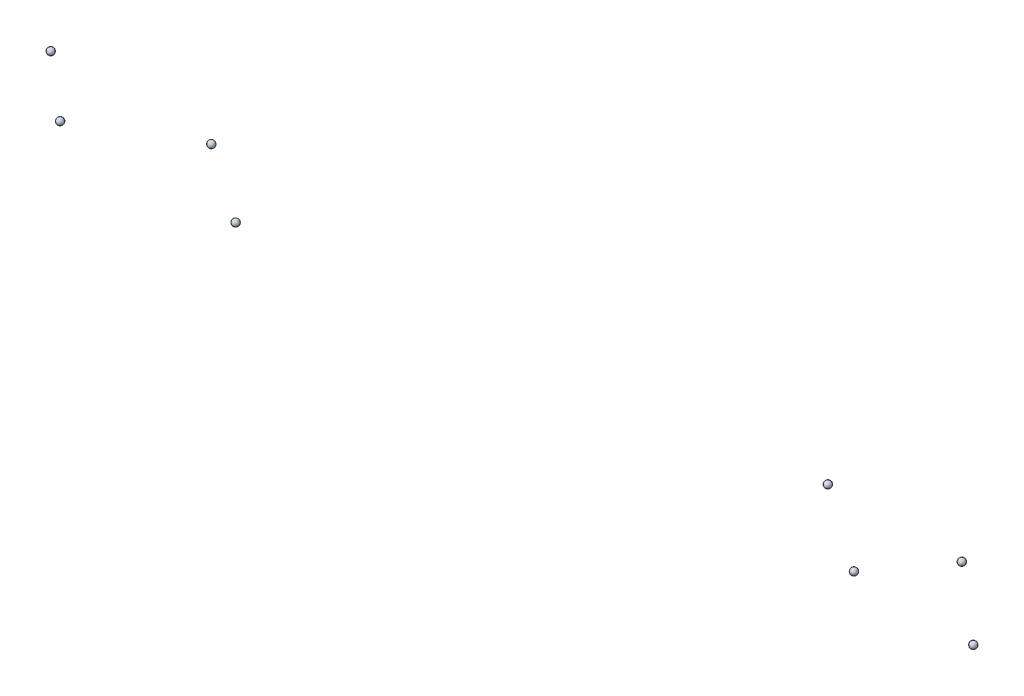
ISO-10303-21;
HEADER;
FILE_DESCRIPTION(('STEP AP214'),'2;1');
FILE_NAME('part.step','',(''),(''),'','','');
FILE_SCHEMA(('AUTOMOTIVE_DESIGN { 1 0 10303 214 1 1 1 1 }'));
ENDSEC;
DATA;
#1=APPLICATION_CONTEXT('core data for automotive mechanical design processes');
#2=APPLICATION_PROTOCOL_DEFINITION('international standard','automotive_design',2000,#1);
#3=PRODUCT_CONTEXT('',#1,'mechanical');
#4=PRODUCT('Part','Part','',(#3));
#5=PRODUCT_RELATED_PRODUCT_CATEGORY('part','',(#4));
#6=PRODUCT_DEFINITION_FORMATION('','',#4);
#7=PRODUCT_DEFINITION_CONTEXT('part definition',#1,'design');
#8=PRODUCT_DEFINITION('design','',#6,#7);
#9=PRODUCT_DEFINITION_SHAPE('','',#8);
#10=(LENGTH_UNIT() NAMED_UNIT(*) SI_UNIT(.MILLI.,.METRE.));
#11=(NAMED_UNIT(*) PLANE_ANGLE_UNIT() SI_UNIT($,.RADIAN.));
#12=(NAMED_UNIT(*) SI_UNIT($,.STERADIAN.) SOLID_ANGLE_UNIT());
#13=UNCERTAINTY_MEASURE_WITH_UNIT(LENGTH_MEASURE(1.E-05),#10,'distance_accuracy_value','');
#14=(GEOMETRIC_REPRESENTATION_CONTEXT(3) GLOBAL_UNCERTAINTY_ASSIGNED_CONTEXT((#13)) GLOBAL_UNIT_ASSIGNED_CONTEXT((#10,
#11,#12)) REPRESENTATION_CONTEXT('',''));
#15=CARTESIAN_POINT('',(0.,0.,0.));
#16=DIRECTION('',(0.,0.,1.));
#17=DIRECTION('',(1.,0.,0.));
#18=AXIS2_PLACEMENT_3D('',#15,#16,#17);
#19=CARTESIAN_POINT('',(-1663.7,-88.9,-63.5));
#20=DIRECTION('',(0.,-1.,0.));
#21=DIRECTION('',(-1.,0.,0.));
#22=AXIS2_PLACEMENT_3D('',#19,#20,#21);
#23=SPHERICAL_SURFACE('',#22,6.34999999999999);
#24=CARTESIAN_POINT('',(-1663.7,-95.25,-63.5));
#25=VERTEX_POINT('',#24);
#26=VERTEX_LOOP('',#25);
#27=FACE_BOUND('',#26,.T.);
#28=ADVANCED_FACE('F48',(#27),#23,.T.);
#29=CLOSED_SHELL('',(#28));
#30=MANIFOLD_SOLID_BREP('B2',#29);
#31=CARTESIAN_POINT('',(-1358.9,-88.9,-63.1553402420195));
#32=DIRECTION('',(0.,1.,0.));
#33=DIRECTION('',(0.,0.,-1.));
#34=AXIS2_PLACEMENT_3D('',#31,#32,#33);
#35=SPHERICAL_SURFACE('',#34,6.34999999999999);
#36=CARTESIAN_POINT('',(-1358.9,-82.55,-63.1553402420195));
#37=VERTEX_POINT('',#36);
#38=VERTEX_LOOP('',#37);
#39=FACE_BOUND('',#38,.T.);
#40=ADVANCED_FACE('F67',(#39),#35,.T.);
#41=CLOSED_SHELL('',(#40));
#42=MANIFOLD_SOLID_BREP('B6',#41);
#43=CARTESIAN_POINT('',(-1676.4,-225.425,-93.98));
#44=DIRECTION('',(0.,1.,0.));
#45=DIRECTION('',(1.,0.,0.));
#46=AXIS2_PLACEMENT_3D('',#43,#44,#45);
#47=SPHERICAL_SURFACE('',#46,6.34999999999999);
#48=CARTESIAN_POINT('',(-1676.4,-219.075,-93.98));
#49=VERTEX_POINT('',#48);
#50=VERTEX_LOOP('',#49);
#51=FACE_BOUND('',#50,.T.);
#52=ADVANCED_FACE('F86',(#51),#47,.T.);
#53=CLOSED_SHELL('',(#52));
#54=MANIFOLD_SOLID_BREP('B44',#53);
#55=CARTESIAN_POINT('',(-1343.66,-225.425,-93.98));
#56=DIRECTION('',(0.,0.,-1.));
#57=DIRECTION('',(1.,0.,0.));
#58=AXIS2_PLACEMENT_3D('',#55,#56,#57);
#59=SPHERICAL_SURFACE('',#58,6.34999999999999);
#60=CARTESIAN_POINT('',(-1343.66,-225.425,-100.33));
#61=VERTEX_POINT('',#60);
#62=VERTEX_LOOP('',#61);
#63=FACE_BOUND('',#62,.T.);
#64=ADVANCED_FACE('F105',(#63),#59,.T.);
#65=CLOSED_SHELL('',(#64));
#66=MANIFOLD_SOLID_BREP('B63',#65);
#67=CARTESIAN_POINT('',(112.3696,-161.925,-36.322));
#68=DIRECTION('',(0.,1.,0.));
#69=DIRECTION('',(1.,0.,0.));
#70=AXIS2_PLACEMENT_3D('',#67,#68,#69);
#71=SPHERICAL_SURFACE('',#70,6.34999999999999);
#72=CARTESIAN_POINT('',(112.3696,-155.575,-36.322));
#73=VERTEX_POINT('',#72);
#74=VERTEX_LOOP('',#73);
#75=FACE_BOUND('',#74,.T.);
#76=ADVANCED_FACE('F124',(#75),#71,.T.);
#77=CLOSED_SHELL('',(#76));
#78=MANIFOLD_SOLID_BREP('B82',#77);
#79=CARTESIAN_POINT('',(-111.76,-152.4,-34.29));
#80=DIRECTION('',(0.,-1.,0.));
#81=DIRECTION('',(-1.,0.,0.));
#82=AXIS2_PLACEMENT_3D('',#79,#80,#81);
#83=SPHERICAL_SURFACE('',#82,6.34999999999999);
#84=CARTESIAN_POINT('',(-111.76,-158.75,-34.29));
#85=VERTEX_POINT('',#84);
#86=VERTEX_LOOP('',#85);
#87=FACE_BOUND('',#86,.T.);
#88=ADVANCED_FACE('F143',(#87),#83,.T.);
#89=CLOSED_SHELL('',(#88));
#90=MANIFOLD_SOLID_BREP('B101',#89);
#91=CARTESIAN_POINT('',(-127.,0.,0.));
#92=DIRECTION('',(0.,0.,-1.));
#93=DIRECTION('',(1.,0.,0.));
#94=AXIS2_PLACEMENT_3D('',#91,#92,#93);
#95=SPHERICAL_SURFACE('',#94,6.35);
#96=CARTESIAN_POINT('',(-127.,0.,-6.35));
#97=VERTEX_POINT('',#96);
#98=VERTEX_LOOP('',#97);
#99=FACE_BOUND('',#98,.T.);
#100=ADVANCED_FACE('F161',(#99),#95,.T.);
#101=CLOSED_SHELL('',(#100));
#102=MANIFOLD_SOLID_BREP('B120',#101);
#103=CARTESIAN_POINT('',(127.,0.,0.));
#104=DIRECTION('',(0.,0.,-1.));
#105=DIRECTION('',(1.,0.,0.));
#106=AXIS2_PLACEMENT_3D('',#103,#104,#105);
#107=SPHERICAL_SURFACE('',#106,6.34999999999995);
#108=CARTESIAN_POINT('',(127.,0.,-6.35));
#109=VERTEX_POINT('',#108);
#110=VERTEX_LOOP('',#109);
#111=FACE_BOUND('',#110,.T.);
#112=ADVANCED_FACE('F174',(#111),#107,.T.);
#113=CLOSED_SHELL('',(#112));
#114=MANIFOLD_SOLID_BREP('B139',#113);
#115=ADVANCED_BREP_SHAPE_REPRESENTATION('',(#18,#30,#42,#54,#66,#78,#90,#102,#114),#14);
#116=SHAPE_DEFINITION_REPRESENTATION(#9,#115);
ENDSEC;
END-ISO-10303-21;
